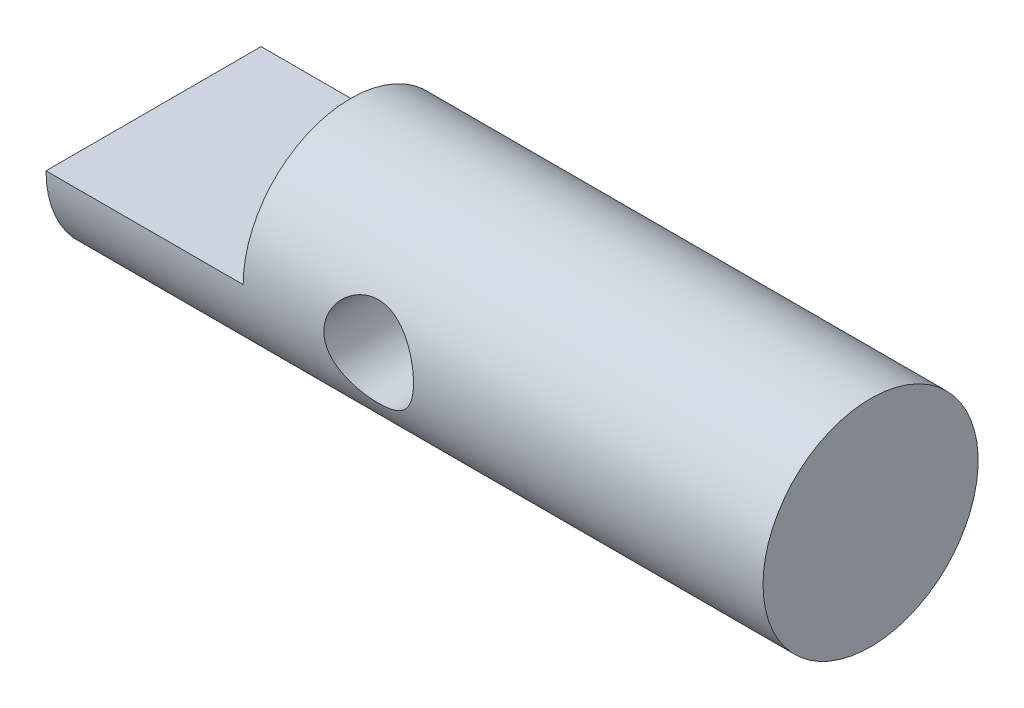
ISO-10303-21;
HEADER;
FILE_DESCRIPTION(('STEP AP214'),'2;1');
FILE_NAME('part.step','',(''),(''),'','','');
FILE_SCHEMA(('AUTOMOTIVE_DESIGN { 1 0 10303 214 1 1 1 1 }'));
ENDSEC;
DATA;
#1=APPLICATION_CONTEXT('core data for automotive mechanical design processes');
#2=APPLICATION_PROTOCOL_DEFINITION('international standard','automotive_design',2000,#1);
#3=PRODUCT_CONTEXT('',#1,'mechanical');
#4=PRODUCT('Part','Part','',(#3));
#5=PRODUCT_RELATED_PRODUCT_CATEGORY('part','',(#4));
#6=PRODUCT_DEFINITION_FORMATION('','',#4);
#7=PRODUCT_DEFINITION_CONTEXT('part definition',#1,'design');
#8=PRODUCT_DEFINITION('design','',#6,#7);
#9=PRODUCT_DEFINITION_SHAPE('','',#8);
#10=(LENGTH_UNIT() NAMED_UNIT(*) SI_UNIT(.MILLI.,.METRE.));
#11=(NAMED_UNIT(*) PLANE_ANGLE_UNIT() SI_UNIT($,.RADIAN.));
#12=(NAMED_UNIT(*) SI_UNIT($,.STERADIAN.) SOLID_ANGLE_UNIT());
#13=UNCERTAINTY_MEASURE_WITH_UNIT(LENGTH_MEASURE(1.E-05),#10,'distance_accuracy_value','');
#14=(GEOMETRIC_REPRESENTATION_CONTEXT(3) GLOBAL_UNCERTAINTY_ASSIGNED_CONTEXT((#13)) GLOBAL_UNIT_ASSIGNED_CONTEXT((#10,
#11,#12)) REPRESENTATION_CONTEXT('',''));
#15=CARTESIAN_POINT('',(0.,0.,0.));
#16=DIRECTION('',(0.,0.,1.));
#17=DIRECTION('',(1.,0.,0.));
#18=AXIS2_PLACEMENT_3D('',#15,#16,#17);
#19=CARTESIAN_POINT('',(-8.9041095890411,4.02739726027398,0.));
#20=DIRECTION('',(-1.,0.,0.));
#21=DIRECTION('',(0.,0.,1.));
#22=AXIS2_PLACEMENT_3D('',#19,#20,#21);
#23=CYLINDRICAL_SURFACE('',#22,3.);
#24=CARTESIAN_POINT('',(1.3458904109589,4.02739726027398,3.));
#25=CARTESIAN_POINT('',(1.3458832058676,4.09435531291024,2.99999458367273));
#26=CARTESIAN_POINT('',(1.34047845243076,4.16141865733782,2.9977323297471));
#27=CARTESIAN_POINT('',(1.31905134603872,4.29364463143032,2.98890153579552));
#28=CARTESIAN_POINT('',(1.30300128649465,4.35880183669754,2.98232175901028));
#29=CARTESIAN_POINT('',(1.26097931917831,4.48508599392706,2.96556289038127));
#30=CARTESIAN_POINT('',(1.23504102149075,4.54622578470024,2.95539599975004));
#31=CARTESIAN_POINT('',(1.17411758772633,4.66322701695378,2.93245286470664));
#32=CARTESIAN_POINT('',(1.13913519198803,4.71909005028992,2.91967741092849));
#33=CARTESIAN_POINT('',(1.05926142836802,4.82684566383349,2.89207828351869));
#34=CARTESIAN_POINT('',(1.01398910216914,4.87843852779175,2.87718753326093));
#35=CARTESIAN_POINT('',(0.915626076176326,4.97355708136524,2.84732714068514));
#36=CARTESIAN_POINT('',(0.86253128606439,5.01707852342706,2.83235746106809));
#37=CARTESIAN_POINT('',(0.746863633394002,5.09693463724463,2.80321021812995));
#38=CARTESIAN_POINT('',(0.683952962532352,5.13281034181323,2.78910786873385));
#39=CARTESIAN_POINT('',(0.552317153037965,5.19333666616263,2.76435572357005));
#40=CARTESIAN_POINT('',(0.483595031474444,5.21799306863688,2.75370415000823));
#41=CARTESIAN_POINT('',(0.345736719190975,5.25414324339557,2.73778555387705));
#42=CARTESIAN_POINT('',(0.276779927566741,5.26621383905003,2.73228387651787));
#43=CARTESIAN_POINT('',(0.137617118272325,5.27864935995194,2.72661326219504));
#44=CARTESIAN_POINT('',(0.0674118109331553,5.27902074081795,2.7264413842526));
#45=CARTESIAN_POINT('',(-0.0665096494760428,5.26848176391072,2.73125119560853));
#46=CARTESIAN_POINT('',(-0.130310685605567,5.25843407139698,2.73583882723623));
#47=CARTESIAN_POINT('',(-0.255221680041495,5.22878917043174,2.74898482773796));
#48=CARTESIAN_POINT('',(-0.316331120532878,5.20919013314575,2.75754395703564));
#49=CARTESIAN_POINT('',(-0.435667292032547,5.16061684754969,2.77786184772756));
#50=CARTESIAN_POINT('',(-0.493805009954484,5.13145197566634,2.78968481949136));
#51=CARTESIAN_POINT('',(-0.604587322921251,5.0647096860796,2.81518331141086));
#52=CARTESIAN_POINT('',(-0.657229739654622,5.02712895079352,2.82885956129779));
#53=CARTESIAN_POINT('',(-0.760209547773943,4.94089322581781,2.85792976877979));
#54=CARTESIAN_POINT('',(-0.809976156426541,4.8915707434815,2.87337121404473));
#55=CARTESIAN_POINT('',(-0.900723092000287,4.78512685132549,2.90325673112529));
#56=CARTESIAN_POINT('',(-0.941701360733283,4.72800361972243,2.9177005687701));
#57=CARTESIAN_POINT('',(-1.01454541265737,4.60584520896735,2.94438283556473));
#58=CARTESIAN_POINT('',(-1.04617903419179,4.54065784272166,2.95656266543334));
#59=CARTESIAN_POINT('',(-1.09783072864437,4.40524966280081,2.97689481414803));
#60=CARTESIAN_POINT('',(-1.11785522098492,4.33503165506901,2.985049358458));
#61=CARTESIAN_POINT('',(-1.14452558116774,4.19632537362021,2.99599641186385));
#62=CARTESIAN_POINT('',(-1.15193744648485,4.12800854555262,2.99909541047125));
#63=CARTESIAN_POINT('',(-1.1554558126552,3.99104260477789,3.00056050368745));
#64=CARTESIAN_POINT('',(-1.15156555929311,3.92239359312134,2.99892795711939));
#65=CARTESIAN_POINT('',(-1.13313850423504,3.79029901793254,2.9913121765694));
#66=CARTESIAN_POINT('',(-1.11913963494391,3.72676429363459,2.9855488728399));
#67=CARTESIAN_POINT('',(-1.08164139450032,3.60301451130289,2.97048606772414));
#68=CARTESIAN_POINT('',(-1.0581408230908,3.54279987375562,2.96118611959704));
#69=CARTESIAN_POINT('',(-1.00153861332899,3.42528826040484,2.93958270645166));
#70=CARTESIAN_POINT('',(-0.968161405895073,3.36814002341865,2.92719491469281));
#71=CARTESIAN_POINT('',(-0.893056211249412,3.26005104404255,2.9007380457909));
#72=CARTESIAN_POINT('',(-0.851324737511832,3.20911290767204,2.88666826768733));
#73=CARTESIAN_POINT('',(-0.757206355768699,3.11106382999971,2.85712087895438));
#74=CARTESIAN_POINT('',(-0.704271086054846,3.06448656229414,2.84161451591029));
#75=CARTESIAN_POINT('',(-0.591088313105714,2.98072741416847,2.81184336768005));
#76=CARTESIAN_POINT('',(-0.530839153869373,2.9435476674178,2.79757886493438));
#77=CARTESIAN_POINT('',(-0.40349541373853,2.87923765818698,2.77181386243988));
#78=CARTESIAN_POINT('',(-0.336315553526276,2.85225807790069,2.76035562555112));
#79=CARTESIAN_POINT('',(-0.197738995231001,2.81022312075825,2.74208355658957));
#80=CARTESIAN_POINT('',(-0.126345826557759,2.7951579116371,2.73526589555752));
#81=CARTESIAN_POINT('',(0.0127091101581028,2.77835645678497,2.72763164537264));
#82=CARTESIAN_POINT('',(0.0802350732515086,2.77568345614268,2.72639350967163));
#83=CARTESIAN_POINT('',(0.214733272099995,2.78124150503485,2.72893853011024));
#84=CARTESIAN_POINT('',(0.281705591272588,2.78947088062676,2.73272091540306));
#85=CARTESIAN_POINT('',(0.409983158427784,2.81581321246906,2.74449551302268));
#86=CARTESIAN_POINT('',(0.471407084422286,2.83344822455931,2.7522835484648));
#87=CARTESIAN_POINT('',(0.590438432316122,2.87763397825263,2.77103181199189));
#88=CARTESIAN_POINT('',(0.648044776357677,2.90418722510146,2.78199293131693));
#89=CARTESIAN_POINT('',(0.761586306908018,2.96729440091908,2.80666954560013));
#90=CARTESIAN_POINT('',(0.817212741127184,3.00435365116914,2.82051102713679));
#91=CARTESIAN_POINT('',(0.921750550319575,3.08671318764358,2.84903689053839));
#92=CARTESIAN_POINT('',(0.970659586559467,3.13201633136836,2.86372156345875));
#93=CARTESIAN_POINT('',(1.06403909264364,3.23349521449515,2.89356392850106));
#94=CARTESIAN_POINT('',(1.10792684379955,3.29022252032495,2.90867817511792));
#95=CARTESIAN_POINT('',(1.18558986450252,3.41079718102078,2.9366014362202));
#96=CARTESIAN_POINT('',(1.21936052584845,3.47464776232823,2.9494093991674));
#97=CARTESIAN_POINT('',(1.27510025639878,3.60666520355602,2.97109183362461));
#98=CARTESIAN_POINT('',(1.29725517757619,3.67474326929334,2.98002782581964));
#99=CARTESIAN_POINT('',(1.32959674003673,3.81398683842742,2.99321009768625));
#100=CARTESIAN_POINT('',(1.33982085348878,3.88514194329302,2.99747105811967));
#101=CARTESIAN_POINT('',(1.34522357204534,3.98016117835479,2.99972287568934));
#102=CARTESIAN_POINT('',(1.34589295310812,4.00377266559832,3.00000191102536));
#103=CARTESIAN_POINT('',(1.3458904109589,4.02739726027398,3.));
#104=B_SPLINE_CURVE_WITH_KNOTS('',3,(#24,#25,#26,#27,#28,#29,#30,#31,#32,#33,#34,#35,#36,#37,
#38,#39,#40,#41,#42,#43,#44,#45,#46,#47,#48,#49,#50,#51,#52,#53,#54,#55,#56,#57,#58,#59,#60,#61,
#62,#63,#64,#65,#66,#67,#68,#69,#70,#71,#72,#73,#74,#75,#76,#77,#78,#79,#80,#81,#82,#83,#84,#85,
#86,#87,#88,#89,#90,#91,#92,#93,#94,#95,#96,#97,#98,#99,#100,#101,#102,#103),.UNSPECIFIED.,.T.,
.F.,(4,2,2,2,2,2,2,2,2,2,2,2,2,2,2,2,2,2,2,2,2,2,2,2,2,2,2,2,2,2,2,2,2,2,2,2,2,2,2,4),(0.,
0.200806918883939,0.402138540628697,0.602791851906301,0.803384436852974,1.01317936288807,
1.22308438131465,1.44331724539125,1.66343646730588,1.87295273137558,2.08235338249046,
2.27570157202557,2.46908679727213,2.66658713058715,2.86416545717207,3.07844141127897,
3.29276749314588,3.51204055060813,3.73119224218297,3.93648443393251,4.14171767493172,
4.33676589735722,4.53183876601785,4.73297135272161,4.93418805469496,5.14978488029295,
5.36543061240342,5.58414788359524,5.80268447074581,6.00439877559644,6.20608211297537,
6.39837649964763,6.59072494950613,6.79463893397442,6.99862373425945,7.2174653500489,
7.43640649428583,7.65172855819386,7.86637250469322,7.93722256499099),.UNSPECIFIED.);
#105=CARTESIAN_POINT('',(1.3458904109589,4.02739726027398,3.));
#106=VERTEX_POINT('',#105);
#107=EDGE_CURVE('E11',#106,#106,#104,.T.);
#108=ORIENTED_EDGE('',*,*,#107,.F.);
#109=EDGE_LOOP('',(#108));
#110=FACE_BOUND('',#109,.T.);
#111=DIRECTION('',(1.,0.,0.));
#112=VECTOR('',#111,1.);
#113=CARTESIAN_POINT('',(-8.9041095890411,4.02739726027398,-3.));
#114=LINE('',#113,#112);
#115=CARTESIAN_POINT('',(-8.9041095890411,4.02739726027398,-3.));
#116=VERTEX_POINT('',#115);
#117=CARTESIAN_POINT('',(-3.4041095890411,4.02739726027398,-3.));
#118=VERTEX_POINT('',#117);
#119=EDGE_CURVE('E72',#116,#118,#114,.T.);
#120=ORIENTED_EDGE('',*,*,#119,.T.);
#121=CARTESIAN_POINT('',(-3.4041095890411,4.02739726027398,0.));
#122=DIRECTION('',(1.,0.,0.));
#123=DIRECTION('',(0.,0.,-1.));
#124=AXIS2_PLACEMENT_3D('',#121,#122,#123);
#125=CIRCLE('',#124,3.);
#126=CARTESIAN_POINT('',(-3.4041095890411,4.02739726027398,3.));
#127=VERTEX_POINT('',#126);
#128=EDGE_CURVE('E44',#127,#118,#125,.F.);
#129=ORIENTED_EDGE('',*,*,#128,.F.);
#130=DIRECTION('',(1.,0.,0.));
#131=VECTOR('',#130,1.);
#132=CARTESIAN_POINT('',(-8.9041095890411,4.02739726027398,3.));
#133=LINE('',#132,#131);
#134=CARTESIAN_POINT('',(-8.9041095890411,4.02739726027398,3.));
#135=VERTEX_POINT('',#134);
#136=EDGE_CURVE('E67',#135,#127,#133,.T.);
#137=ORIENTED_EDGE('',*,*,#136,.F.);
#138=CARTESIAN_POINT('',(-8.9041095890411,4.02739726027398,0.));
#139=DIRECTION('',(-1.,0.,0.));
#140=DIRECTION('',(0.,0.,1.));
#141=AXIS2_PLACEMENT_3D('',#138,#139,#140);
#142=CIRCLE('',#141,3.);
#143=EDGE_CURVE('E76',#116,#135,#142,.T.);
#144=ORIENTED_EDGE('',*,*,#143,.F.);
#145=EDGE_LOOP('',(#120,#129,#137,#144));
#146=FACE_BOUND('',#145,.T.);
#147=CARTESIAN_POINT('',(11.0958904109589,4.02739726027398,0.));
#148=DIRECTION('',(-1.,0.,0.));
#149=DIRECTION('',(0.,0.,1.));
#150=AXIS2_PLACEMENT_3D('',#147,#148,#149);
#151=CIRCLE('',#150,3.);
#152=CARTESIAN_POINT('',(11.0958904109589,4.02739726027398,3.));
#153=VERTEX_POINT('',#152);
#154=EDGE_CURVE('E65',#153,#153,#151,.T.);
#155=ORIENTED_EDGE('',*,*,#154,.T.);
#156=EDGE_LOOP('',(#155));
#157=FACE_BOUND('',#156,.T.);
#158=ADVANCED_FACE('F33',(#110,#146,#157),#23,.T.);
#159=CARTESIAN_POINT('',(-8.9041095890411,4.02739726027398,0.));
#160=DIRECTION('',(-1.,0.,0.));
#161=DIRECTION('',(0.,0.,1.));
#162=AXIS2_PLACEMENT_3D('',#159,#160,#161);
#163=PLANE('',#162);
#164=DIRECTION('',(0.,0.,1.));
#165=VECTOR('',#164,1.);
#166=CARTESIAN_POINT('',(-8.9041095890411,4.02739726027398,-3.));
#167=LINE('',#166,#165);
#168=EDGE_CURVE('E51',#116,#135,#167,.T.);
#169=ORIENTED_EDGE('',*,*,#168,.F.);
#170=ORIENTED_EDGE('',*,*,#143,.T.);
#171=EDGE_LOOP('',(#169,#170));
#172=FACE_BOUND('',#171,.T.);
#173=ADVANCED_FACE('F35',(#172),#163,.T.);
#174=CARTESIAN_POINT('',(11.0958904109589,4.02739726027398,0.));
#175=DIRECTION('',(1.,0.,0.));
#176=DIRECTION('',(0.,0.,-1.));
#177=AXIS2_PLACEMENT_3D('',#174,#175,#176);
#178=PLANE('',#177);
#179=ORIENTED_EDGE('',*,*,#154,.F.);
#180=EDGE_LOOP('',(#179));
#181=FACE_BOUND('',#180,.T.);
#182=ADVANCED_FACE('F104',(#181),#178,.T.);
#183=CARTESIAN_POINT('',(-3.4041095890411,4.02739726027398,-3.));
#184=DIRECTION('',(1.,0.,0.));
#185=DIRECTION('',(0.,0.,-1.));
#186=AXIS2_PLACEMENT_3D('',#183,#184,#185);
#187=PLANE('',#186);
#188=ORIENTED_EDGE('',*,*,#128,.T.);
#189=DIRECTION('',(0.,0.,1.));
#190=VECTOR('',#189,1.);
#191=CARTESIAN_POINT('',(-3.4041095890411,4.02739726027398,-3.));
#192=LINE('',#191,#190);
#193=EDGE_CURVE('E62',#118,#127,#192,.T.);
#194=ORIENTED_EDGE('',*,*,#193,.T.);
#195=EDGE_LOOP('',(#188,#194));
#196=FACE_BOUND('',#195,.T.);
#197=ADVANCED_FACE('F63',(#196),#187,.F.);
#198=CARTESIAN_POINT('',(-8.9041095890411,4.02739726027398,-3.));
#199=DIRECTION('',(0.,-1.,0.));
#200=DIRECTION('',(0.,0.,-1.));
#201=AXIS2_PLACEMENT_3D('',#198,#199,#200);
#202=PLANE('',#201);
#203=ORIENTED_EDGE('',*,*,#193,.F.);
#204=ORIENTED_EDGE('',*,*,#119,.F.);
#205=ORIENTED_EDGE('',*,*,#168,.T.);
#206=ORIENTED_EDGE('',*,*,#136,.T.);
#207=EDGE_LOOP('',(#203,#204,#205,#206));
#208=FACE_BOUND('',#207,.T.);
#209=ADVANCED_FACE('F68',(#208),#202,.F.);
#210=CARTESIAN_POINT('',(0.0958904109588949,4.02739726027398,-0.2));
#211=DIRECTION('',(0.,0.,1.));
#212=DIRECTION('',(1.,0.,0.));
#213=AXIS2_PLACEMENT_3D('',#210,#211,#212);
#214=CYLINDRICAL_SURFACE('',#213,1.25);
#215=ORIENTED_EDGE('',*,*,#107,.T.);
#216=EDGE_LOOP('',(#215));
#217=FACE_BOUND('',#216,.T.);
#218=CARTESIAN_POINT('',(0.0958904109588949,4.02739726027398,-0.2));
#219=DIRECTION('',(0.,0.,1.));
#220=DIRECTION('',(1.,0.,0.));
#221=AXIS2_PLACEMENT_3D('',#218,#219,#220);
#222=CIRCLE('',#221,1.25);
#223=CARTESIAN_POINT('',(1.3458904109589,4.02739726027398,-0.2));
#224=VERTEX_POINT('',#223);
#225=EDGE_CURVE('E73',#224,#224,#222,.T.);
#226=ORIENTED_EDGE('',*,*,#225,.F.);
#227=EDGE_LOOP('',(#226));
#228=FACE_BOUND('',#227,.T.);
#229=ADVANCED_FACE('F88',(#217,#228),#214,.F.);
#230=CARTESIAN_POINT('',(0.,0.,-0.2));
#231=DIRECTION('',(0.,0.,1.));
#232=DIRECTION('',(1.,0.,0.));
#233=AXIS2_PLACEMENT_3D('',#230,#231,#232);
#234=PLANE('',#233);
#235=ORIENTED_EDGE('',*,*,#225,.T.);
#236=EDGE_LOOP('',(#235));
#237=FACE_BOUND('',#236,.T.);
#238=ADVANCED_FACE('F86',(#237),#234,.T.);
#239=CLOSED_SHELL('',(#158,#173,#182,#197,#209,#229,#238));
#240=MANIFOLD_SOLID_BREP('B2',#239);
#241=ADVANCED_BREP_SHAPE_REPRESENTATION('',(#18,#240),#14);
#242=SHAPE_DEFINITION_REPRESENTATION(#9,#241);
ENDSEC;
END-ISO-10303-21;
